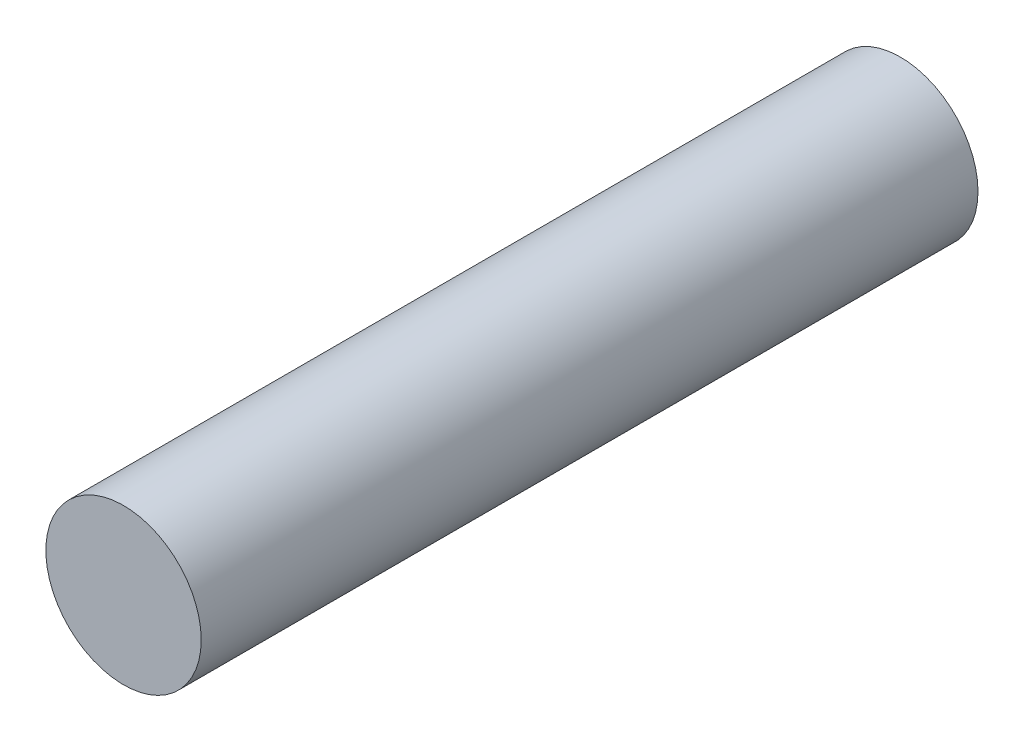
ISO-10303-21;
HEADER;
FILE_DESCRIPTION(('STEP AP214'),'2;1');
FILE_NAME('part.step','',(''),(''),'','','');
FILE_SCHEMA(('AUTOMOTIVE_DESIGN { 1 0 10303 214 1 1 1 1 }'));
ENDSEC;
DATA;
#1=APPLICATION_CONTEXT('core data for automotive mechanical design processes');
#2=APPLICATION_PROTOCOL_DEFINITION('international standard','automotive_design',2000,#1);
#3=PRODUCT_CONTEXT('',#1,'mechanical');
#4=PRODUCT('Part','Part','',(#3));
#5=PRODUCT_RELATED_PRODUCT_CATEGORY('part','',(#4));
#6=PRODUCT_DEFINITION_FORMATION('','',#4);
#7=PRODUCT_DEFINITION_CONTEXT('part definition',#1,'design');
#8=PRODUCT_DEFINITION('design','',#6,#7);
#9=PRODUCT_DEFINITION_SHAPE('','',#8);
#10=(LENGTH_UNIT() NAMED_UNIT(*) SI_UNIT(.MILLI.,.METRE.));
#11=(NAMED_UNIT(*) PLANE_ANGLE_UNIT() SI_UNIT($,.RADIAN.));
#12=(NAMED_UNIT(*) SI_UNIT($,.STERADIAN.) SOLID_ANGLE_UNIT());
#13=UNCERTAINTY_MEASURE_WITH_UNIT(LENGTH_MEASURE(1.E-05),#10,'distance_accuracy_value','');
#14=(GEOMETRIC_REPRESENTATION_CONTEXT(3) GLOBAL_UNCERTAINTY_ASSIGNED_CONTEXT((#13)) GLOBAL_UNIT_ASSIGNED_CONTEXT((#10,
#11,#12)) REPRESENTATION_CONTEXT('',''));
#15=CARTESIAN_POINT('',(0.,0.,0.));
#16=DIRECTION('',(0.,0.,1.));
#17=DIRECTION('',(1.,0.,0.));
#18=AXIS2_PLACEMENT_3D('',#15,#16,#17);
#19=CARTESIAN_POINT('',(0.,0.,75.));
#20=DIRECTION('',(0.,0.,-1.));
#21=DIRECTION('',(-1.,0.,0.));
#22=AXIS2_PLACEMENT_3D('',#19,#20,#21);
#23=CYLINDRICAL_SURFACE('',#22,7.5);
#24=CARTESIAN_POINT('',(0.,0.,75.));
#25=DIRECTION('',(0.,0.,1.));
#26=DIRECTION('',(1.,0.,0.));
#27=AXIS2_PLACEMENT_3D('',#24,#25,#26);
#28=CIRCLE('',#27,7.5);
#29=CARTESIAN_POINT('',(7.5,0.,75.));
#30=VERTEX_POINT('',#29);
#31=EDGE_CURVE('E10',#30,#30,#28,.T.);
#32=ORIENTED_EDGE('',*,*,#31,.F.);
#33=EDGE_LOOP('',(#32));
#34=FACE_BOUND('',#33,.T.);
#35=CARTESIAN_POINT('',(0.,0.,0.));
#36=DIRECTION('',(0.,0.,1.));
#37=DIRECTION('',(1.,0.,0.));
#38=AXIS2_PLACEMENT_3D('',#35,#36,#37);
#39=CIRCLE('',#38,7.5);
#40=CARTESIAN_POINT('',(7.5,0.,0.));
#41=VERTEX_POINT('',#40);
#42=EDGE_CURVE('E40',#41,#41,#39,.T.);
#43=ORIENTED_EDGE('',*,*,#42,.T.);
#44=EDGE_LOOP('',(#43));
#45=FACE_BOUND('',#44,.T.);
#46=ADVANCED_FACE('F37',(#34,#45),#23,.T.);
#47=CARTESIAN_POINT('',(0.,0.,75.));
#48=DIRECTION('',(0.,0.,1.));
#49=DIRECTION('',(1.,0.,0.));
#50=AXIS2_PLACEMENT_3D('',#47,#48,#49);
#51=PLANE('',#50);
#52=ORIENTED_EDGE('',*,*,#31,.T.);
#53=EDGE_LOOP('',(#52));
#54=FACE_BOUND('',#53,.T.);
#55=ADVANCED_FACE('F52',(#54),#51,.T.);
#56=CARTESIAN_POINT('',(0.,0.,0.));
#57=DIRECTION('',(0.,0.,1.));
#58=DIRECTION('',(1.,0.,0.));
#59=AXIS2_PLACEMENT_3D('',#56,#57,#58);
#60=PLANE('',#59);
#61=ORIENTED_EDGE('',*,*,#42,.F.);
#62=EDGE_LOOP('',(#61));
#63=FACE_BOUND('',#62,.T.);
#64=ADVANCED_FACE('F50',(#63),#60,.F.);
#65=CLOSED_SHELL('',(#46,#55,#64));
#66=MANIFOLD_SOLID_BREP('B2',#65);
#67=ADVANCED_BREP_SHAPE_REPRESENTATION('',(#18,#66),#14);
#68=SHAPE_DEFINITION_REPRESENTATION(#9,#67);
ENDSEC;
END-ISO-10303-21;
